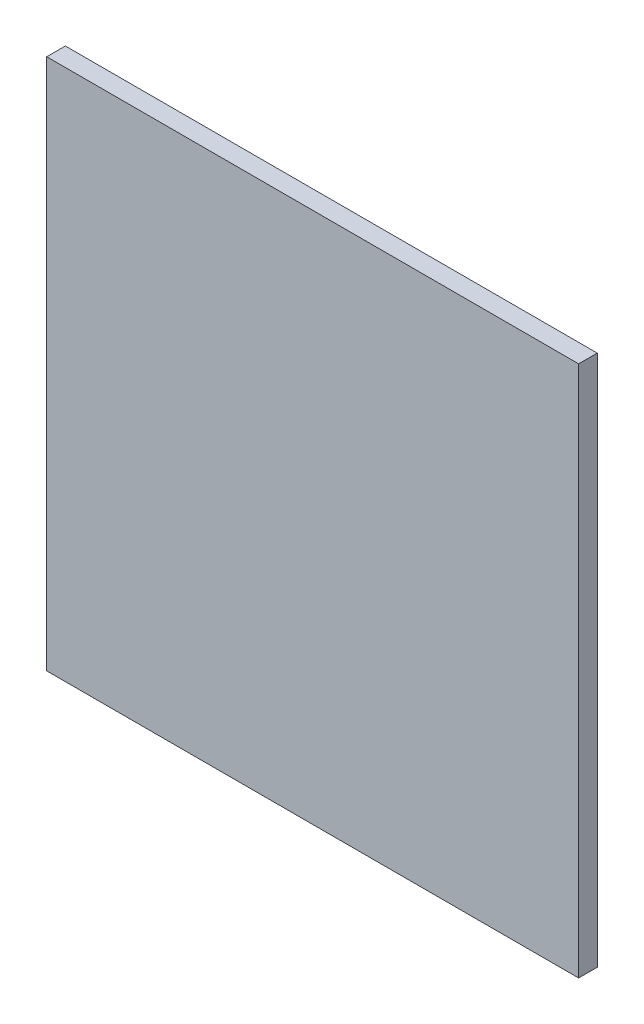
ISO-10303-21;
HEADER;
FILE_DESCRIPTION(('STEP AP214'),'2;1');
FILE_NAME('part.step','',(''),(''),'','','');
FILE_SCHEMA(('AUTOMOTIVE_DESIGN { 1 0 10303 214 1 1 1 1 }'));
ENDSEC;
DATA;
#1=APPLICATION_CONTEXT('core data for automotive mechanical design processes');
#2=APPLICATION_PROTOCOL_DEFINITION('international standard','automotive_design',2000,#1);
#3=PRODUCT_CONTEXT('',#1,'mechanical');
#4=PRODUCT('Part','Part','',(#3));
#5=PRODUCT_RELATED_PRODUCT_CATEGORY('part','',(#4));
#6=PRODUCT_DEFINITION_FORMATION('','',#4);
#7=PRODUCT_DEFINITION_CONTEXT('part definition',#1,'design');
#8=PRODUCT_DEFINITION('design','',#6,#7);
#9=PRODUCT_DEFINITION_SHAPE('','',#8);
#10=(LENGTH_UNIT() NAMED_UNIT(*) SI_UNIT(.MILLI.,.METRE.));
#11=(NAMED_UNIT(*) PLANE_ANGLE_UNIT() SI_UNIT($,.RADIAN.));
#12=(NAMED_UNIT(*) SI_UNIT($,.STERADIAN.) SOLID_ANGLE_UNIT());
#13=UNCERTAINTY_MEASURE_WITH_UNIT(LENGTH_MEASURE(1.E-05),#10,'distance_accuracy_value','');
#14=(GEOMETRIC_REPRESENTATION_CONTEXT(3) GLOBAL_UNCERTAINTY_ASSIGNED_CONTEXT((#13)) GLOBAL_UNIT_ASSIGNED_CONTEXT((#10,
#11,#12)) REPRESENTATION_CONTEXT('',''));
#15=CARTESIAN_POINT('',(0.,0.,0.));
#16=DIRECTION('',(0.,0.,1.));
#17=DIRECTION('',(1.,0.,0.));
#18=AXIS2_PLACEMENT_3D('',#15,#16,#17);
#19=CARTESIAN_POINT('',(6.85,4.41,-1.07));
#20=DIRECTION('',(1.,0.,0.));
#21=DIRECTION('',(0.,1.,0.));
#22=AXIS2_PLACEMENT_3D('',#19,#20,#21);
#23=PLANE('',#22);
#24=DIRECTION('',(0.,1.,0.));
#25=VECTOR('',#24,1.);
#26=CARTESIAN_POINT('',(6.85,4.41,-1.035));
#27=LINE('',#26,#25);
#28=CARTESIAN_POINT('',(6.85,3.41,-1.035));
#29=VERTEX_POINT('',#28);
#30=CARTESIAN_POINT('',(6.85,4.41,-1.035));
#31=VERTEX_POINT('',#30);
#32=EDGE_CURVE('E11',#29,#31,#27,.T.);
#33=ORIENTED_EDGE('',*,*,#32,.F.);
#34=DIRECTION('',(0.,0.,1.));
#35=VECTOR('',#34,1.);
#36=CARTESIAN_POINT('',(6.85,3.41,-1.07));
#37=LINE('',#36,#35);
#38=CARTESIAN_POINT('',(6.85,3.41,-1.07));
#39=VERTEX_POINT('',#38);
#40=EDGE_CURVE('E24',#39,#29,#37,.T.);
#41=ORIENTED_EDGE('',*,*,#40,.F.);
#42=DIRECTION('',(0.,1.,0.));
#43=VECTOR('',#42,1.);
#44=CARTESIAN_POINT('',(6.85,4.41,-1.07));
#45=LINE('',#44,#43);
#46=CARTESIAN_POINT('',(6.85,4.41,-1.07));
#47=VERTEX_POINT('',#46);
#48=EDGE_CURVE('E88',#39,#47,#45,.T.);
#49=ORIENTED_EDGE('',*,*,#48,.T.);
#50=DIRECTION('',(0.,0.,1.));
#51=VECTOR('',#50,1.);
#52=CARTESIAN_POINT('',(6.85,4.41,-1.07));
#53=LINE('',#52,#51);
#54=EDGE_CURVE('E77',#47,#31,#53,.T.);
#55=ORIENTED_EDGE('',*,*,#54,.T.);
#56=EDGE_LOOP('',(#33,#41,#49,#55));
#57=FACE_BOUND('',#56,.T.);
#58=ADVANCED_FACE('F17',(#57),#23,.T.);
#59=CARTESIAN_POINT('',(6.85,3.41,-1.07));
#60=DIRECTION('',(0.,-1.,0.));
#61=DIRECTION('',(0.,0.,-1.));
#62=AXIS2_PLACEMENT_3D('',#59,#60,#61);
#63=PLANE('',#62);
#64=DIRECTION('',(1.,0.,0.));
#65=VECTOR('',#64,1.);
#66=CARTESIAN_POINT('',(6.85,3.41,-1.035));
#67=LINE('',#66,#65);
#68=CARTESIAN_POINT('',(5.85,3.41,-1.035));
#69=VERTEX_POINT('',#68);
#70=EDGE_CURVE('E85',#69,#29,#67,.T.);
#71=ORIENTED_EDGE('',*,*,#70,.F.);
#72=DIRECTION('',(0.,0.,1.));
#73=VECTOR('',#72,1.);
#74=CARTESIAN_POINT('',(5.85,3.41,-1.07));
#75=LINE('',#74,#73);
#76=CARTESIAN_POINT('',(5.85,3.41,-1.07));
#77=VERTEX_POINT('',#76);
#78=EDGE_CURVE('E83',#77,#69,#75,.T.);
#79=ORIENTED_EDGE('',*,*,#78,.F.);
#80=DIRECTION('',(1.,0.,0.));
#81=VECTOR('',#80,1.);
#82=CARTESIAN_POINT('',(6.85,3.41,-1.07));
#83=LINE('',#82,#81);
#84=EDGE_CURVE('E72',#77,#39,#83,.T.);
#85=ORIENTED_EDGE('',*,*,#84,.T.);
#86=ORIENTED_EDGE('',*,*,#40,.T.);
#87=EDGE_LOOP('',(#71,#79,#85,#86));
#88=FACE_BOUND('',#87,.T.);
#89=ADVANCED_FACE('F90',(#88),#63,.T.);
#90=CARTESIAN_POINT('',(5.85,3.41,-1.07));
#91=DIRECTION('',(-1.,0.,0.));
#92=DIRECTION('',(0.,0.,1.));
#93=AXIS2_PLACEMENT_3D('',#90,#91,#92);
#94=PLANE('',#93);
#95=DIRECTION('',(0.,-1.,0.));
#96=VECTOR('',#95,1.);
#97=CARTESIAN_POINT('',(5.85,3.41,-1.035));
#98=LINE('',#97,#96);
#99=CARTESIAN_POINT('',(5.85,4.41,-1.035));
#100=VERTEX_POINT('',#99);
#101=EDGE_CURVE('E60',#100,#69,#98,.T.);
#102=ORIENTED_EDGE('',*,*,#101,.F.);
#103=DIRECTION('',(0.,0.,1.));
#104=VECTOR('',#103,1.);
#105=CARTESIAN_POINT('',(5.85,4.41,-1.07));
#106=LINE('',#105,#104);
#107=CARTESIAN_POINT('',(5.85,4.41,-1.07));
#108=VERTEX_POINT('',#107);
#109=EDGE_CURVE('E54',#108,#100,#106,.T.);
#110=ORIENTED_EDGE('',*,*,#109,.F.);
#111=DIRECTION('',(0.,-1.,0.));
#112=VECTOR('',#111,1.);
#113=CARTESIAN_POINT('',(5.85,3.41,-1.07));
#114=LINE('',#113,#112);
#115=EDGE_CURVE('E58',#108,#77,#114,.T.);
#116=ORIENTED_EDGE('',*,*,#115,.T.);
#117=ORIENTED_EDGE('',*,*,#78,.T.);
#118=EDGE_LOOP('',(#102,#110,#116,#117));
#119=FACE_BOUND('',#118,.T.);
#120=ADVANCED_FACE('F56',(#119),#94,.T.);
#121=CARTESIAN_POINT('',(5.85,4.41,-1.07));
#122=DIRECTION('',(0.,1.,0.));
#123=DIRECTION('',(1.,0.,0.));
#124=AXIS2_PLACEMENT_3D('',#121,#122,#123);
#125=PLANE('',#124);
#126=DIRECTION('',(-1.,0.,0.));
#127=VECTOR('',#126,1.);
#128=CARTESIAN_POINT('',(5.85,4.41,-1.035));
#129=LINE('',#128,#127);
#130=EDGE_CURVE('E73',#31,#100,#129,.T.);
#131=ORIENTED_EDGE('',*,*,#130,.F.);
#132=ORIENTED_EDGE('',*,*,#54,.F.);
#133=DIRECTION('',(-1.,0.,0.));
#134=VECTOR('',#133,1.);
#135=CARTESIAN_POINT('',(5.85,4.41,-1.07));
#136=LINE('',#135,#134);
#137=EDGE_CURVE('E70',#47,#108,#136,.T.);
#138=ORIENTED_EDGE('',*,*,#137,.T.);
#139=ORIENTED_EDGE('',*,*,#109,.T.);
#140=EDGE_LOOP('',(#131,#132,#138,#139));
#141=FACE_BOUND('',#140,.T.);
#142=ADVANCED_FACE('F76',(#141),#125,.T.);
#143=CARTESIAN_POINT('',(0.,0.,-1.07));
#144=DIRECTION('',(0.,0.,-1.));
#145=DIRECTION('',(0.,-1.,0.));
#146=AXIS2_PLACEMENT_3D('',#143,#144,#145);
#147=PLANE('',#146);
#148=ORIENTED_EDGE('',*,*,#48,.F.);
#149=ORIENTED_EDGE('',*,*,#84,.F.);
#150=ORIENTED_EDGE('',*,*,#115,.F.);
#151=ORIENTED_EDGE('',*,*,#137,.F.);
#152=EDGE_LOOP('',(#148,#149,#150,#151));
#153=FACE_BOUND('',#152,.T.);
#154=ADVANCED_FACE('F69',(#153),#147,.T.);
#155=CARTESIAN_POINT('',(0.,0.,-1.035));
#156=DIRECTION('',(0.,0.,-1.));
#157=DIRECTION('',(0.,-1.,0.));
#158=AXIS2_PLACEMENT_3D('',#155,#156,#157);
#159=PLANE('',#158);
#160=ORIENTED_EDGE('',*,*,#32,.T.);
#161=ORIENTED_EDGE('',*,*,#130,.T.);
#162=ORIENTED_EDGE('',*,*,#101,.T.);
#163=ORIENTED_EDGE('',*,*,#70,.T.);
#164=EDGE_LOOP('',(#160,#161,#162,#163));
#165=FACE_BOUND('',#164,.T.);
#166=ADVANCED_FACE('F91',(#165),#159,.F.);
#167=CLOSED_SHELL('',(#58,#89,#120,#142,#154,#166));
#168=MANIFOLD_SOLID_BREP('B1',#167);
#169=ADVANCED_BREP_SHAPE_REPRESENTATION('',(#18,#168),#14);
#170=SHAPE_DEFINITION_REPRESENTATION(#9,#169);
ENDSEC;
END-ISO-10303-21;
